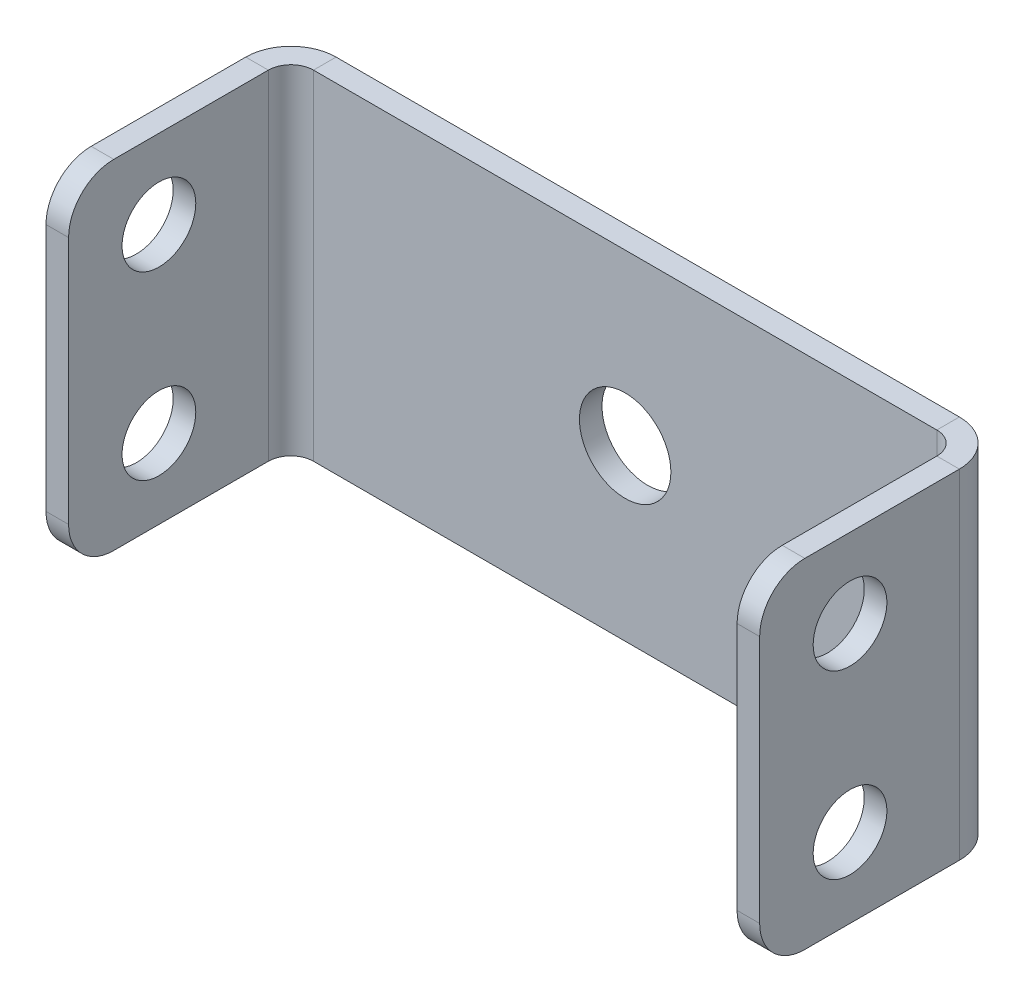
ISO-10303-21;
HEADER;
FILE_DESCRIPTION(('STEP AP214'),'2;1');
FILE_NAME('part.step','',(''),(''),'','','');
FILE_SCHEMA(('AUTOMOTIVE_DESIGN { 1 0 10303 214 1 1 1 1 }'));
ENDSEC;
DATA;
#1=APPLICATION_CONTEXT('core data for automotive mechanical design processes');
#2=APPLICATION_PROTOCOL_DEFINITION('international standard','automotive_design',2000,#1);
#3=PRODUCT_CONTEXT('',#1,'mechanical');
#4=PRODUCT('Part','Part','',(#3));
#5=PRODUCT_RELATED_PRODUCT_CATEGORY('part','',(#4));
#6=PRODUCT_DEFINITION_FORMATION('','',#4);
#7=PRODUCT_DEFINITION_CONTEXT('part definition',#1,'design');
#8=PRODUCT_DEFINITION('design','',#6,#7);
#9=PRODUCT_DEFINITION_SHAPE('','',#8);
#10=(LENGTH_UNIT() NAMED_UNIT(*) SI_UNIT(.MILLI.,.METRE.));
#11=(NAMED_UNIT(*) PLANE_ANGLE_UNIT() SI_UNIT($,.RADIAN.));
#12=(NAMED_UNIT(*) SI_UNIT($,.STERADIAN.) SOLID_ANGLE_UNIT());
#13=UNCERTAINTY_MEASURE_WITH_UNIT(LENGTH_MEASURE(1.E-05),#10,'distance_accuracy_value','');
#14=(GEOMETRIC_REPRESENTATION_CONTEXT(3) GLOBAL_UNCERTAINTY_ASSIGNED_CONTEXT((#13)) GLOBAL_UNIT_ASSIGNED_CONTEXT((#10,
#11,#12)) REPRESENTATION_CONTEXT('',''));
#15=CARTESIAN_POINT('',(0.,0.,0.));
#16=DIRECTION('',(0.,0.,1.));
#17=DIRECTION('',(1.,0.,0.));
#18=AXIS2_PLACEMENT_3D('',#15,#16,#17);
#19=CARTESIAN_POINT('',(0.,0.,-1.));
#20=DIRECTION('',(0.,0.,1.));
#21=DIRECTION('',(1.,0.,0.));
#22=AXIS2_PLACEMENT_3D('',#19,#20,#21);
#23=PLANE('',#22);
#24=CARTESIAN_POINT('',(0.,0.,-1.));
#25=DIRECTION('',(0.,0.,1.));
#26=DIRECTION('',(1.,0.,0.));
#27=AXIS2_PLACEMENT_3D('',#24,#25,#26);
#28=CIRCLE('',#27,2.025);
#29=CARTESIAN_POINT('',(2.025,0.,-1.));
#30=VERTEX_POINT('',#29);
#31=EDGE_CURVE('E257',#30,#30,#28,.T.);
#32=ORIENTED_EDGE('',*,*,#31,.T.);
#33=EDGE_LOOP('',(#32));
#34=FACE_BOUND('',#33,.T.);
#35=DIRECTION('',(-1.,0.,0.));
#36=VECTOR('',#35,1.);
#37=CARTESIAN_POINT('',(-25.,7.5,-1.));
#38=LINE('',#37,#36);
#39=CARTESIAN_POINT('',(13.8,7.5,-1.));
#40=VERTEX_POINT('',#39);
#41=CARTESIAN_POINT('',(-13.8,7.5,-1.));
#42=VERTEX_POINT('',#41);
#43=EDGE_CURVE('E286',#40,#42,#38,.T.);
#44=ORIENTED_EDGE('',*,*,#43,.F.);
#45=DIRECTION('',(0.,-1.,0.));
#46=VECTOR('',#45,1.);
#47=CARTESIAN_POINT('',(13.8,0.,-1.));
#48=LINE('',#47,#46);
#49=CARTESIAN_POINT('',(13.8,-7.5,-1.));
#50=VERTEX_POINT('',#49);
#51=EDGE_CURVE('E196',#40,#50,#48,.T.);
#52=ORIENTED_EDGE('',*,*,#51,.T.);
#53=DIRECTION('',(1.,0.,0.));
#54=VECTOR('',#53,1.);
#55=CARTESIAN_POINT('',(-25.,-7.5,-1.));
#56=LINE('',#55,#54);
#57=CARTESIAN_POINT('',(-13.8,-7.5,-1.));
#58=VERTEX_POINT('',#57);
#59=EDGE_CURVE('E266',#58,#50,#56,.T.);
#60=ORIENTED_EDGE('',*,*,#59,.F.);
#61=DIRECTION('',(0.,1.,0.));
#62=VECTOR('',#61,1.);
#63=CARTESIAN_POINT('',(-13.8,0.,-1.));
#64=LINE('',#63,#62);
#65=EDGE_CURVE('E263',#58,#42,#64,.T.);
#66=ORIENTED_EDGE('',*,*,#65,.T.);
#67=EDGE_LOOP('',(#44,#52,#60,#66));
#68=FACE_BOUND('',#67,.T.);
#69=ADVANCED_FACE('F43',(#34,#68),#23,.F.);
#70=CARTESIAN_POINT('',(-25.,-7.5,-1.));
#71=DIRECTION('',(0.,-1.,0.));
#72=DIRECTION('',(0.,0.,-1.));
#73=AXIS2_PLACEMENT_3D('',#70,#71,#72);
#74=PLANE('',#73);
#75=DIRECTION('',(0.,0.,-1.));
#76=VECTOR('',#75,1.);
#77=CARTESIAN_POINT('',(13.8,-7.5,-1.));
#78=LINE('',#77,#76);
#79=CARTESIAN_POINT('',(13.8,-7.5,0.));
#80=VERTEX_POINT('',#79);
#81=EDGE_CURVE('E281',#80,#50,#78,.T.);
#82=ORIENTED_EDGE('',*,*,#81,.F.);
#83=DIRECTION('',(1.,0.,0.));
#84=VECTOR('',#83,1.);
#85=CARTESIAN_POINT('',(-25.,-7.5,0.));
#86=LINE('',#85,#84);
#87=CARTESIAN_POINT('',(-13.8,-7.5,0.));
#88=VERTEX_POINT('',#87);
#89=EDGE_CURVE('E287',#88,#80,#86,.T.);
#90=ORIENTED_EDGE('',*,*,#89,.F.);
#91=DIRECTION('',(0.,0.,1.));
#92=VECTOR('',#91,1.);
#93=CARTESIAN_POINT('',(-13.8,-7.5,-1.));
#94=LINE('',#93,#92);
#95=EDGE_CURVE('E265',#58,#88,#94,.T.);
#96=ORIENTED_EDGE('',*,*,#95,.F.);
#97=ORIENTED_EDGE('',*,*,#59,.T.);
#98=EDGE_LOOP('',(#82,#90,#96,#97));
#99=FACE_BOUND('',#98,.T.);
#100=ADVANCED_FACE('F353',(#99),#74,.T.);
#101=CARTESIAN_POINT('',(-25.,7.5,-1.));
#102=DIRECTION('',(0.,1.,0.));
#103=DIRECTION('',(0.,0.,1.));
#104=AXIS2_PLACEMENT_3D('',#101,#102,#103);
#105=PLANE('',#104);
#106=DIRECTION('',(0.,0.,1.));
#107=VECTOR('',#106,1.);
#108=CARTESIAN_POINT('',(13.8,7.5,-1.));
#109=LINE('',#108,#107);
#110=CARTESIAN_POINT('',(13.8,7.5,0.));
#111=VERTEX_POINT('',#110);
#112=EDGE_CURVE('E276',#40,#111,#109,.T.);
#113=ORIENTED_EDGE('',*,*,#112,.F.);
#114=ORIENTED_EDGE('',*,*,#43,.T.);
#115=DIRECTION('',(0.,0.,-1.));
#116=VECTOR('',#115,1.);
#117=CARTESIAN_POINT('',(-13.8,7.5,-1.));
#118=LINE('',#117,#116);
#119=CARTESIAN_POINT('',(-13.8,7.5,0.));
#120=VERTEX_POINT('',#119);
#121=EDGE_CURVE('E272',#120,#42,#118,.T.);
#122=ORIENTED_EDGE('',*,*,#121,.F.);
#123=DIRECTION('',(-1.,0.,0.));
#124=VECTOR('',#123,1.);
#125=CARTESIAN_POINT('',(-25.,7.5,0.));
#126=LINE('',#125,#124);
#127=EDGE_CURVE('E260',#111,#120,#126,.T.);
#128=ORIENTED_EDGE('',*,*,#127,.F.);
#129=EDGE_LOOP('',(#113,#114,#122,#128));
#130=FACE_BOUND('',#129,.T.);
#131=ADVANCED_FACE('F362',(#130),#105,.T.);
#132=CARTESIAN_POINT('',(0.,0.,0.));
#133=DIRECTION('',(0.,0.,1.));
#134=DIRECTION('',(1.,0.,0.));
#135=AXIS2_PLACEMENT_3D('',#132,#133,#134);
#136=PLANE('',#135);
#137=DIRECTION('',(0.,-1.,0.));
#138=VECTOR('',#137,1.);
#139=CARTESIAN_POINT('',(13.8,0.,0.));
#140=LINE('',#139,#138);
#141=EDGE_CURVE('E278',#111,#80,#140,.T.);
#142=ORIENTED_EDGE('',*,*,#141,.F.);
#143=ORIENTED_EDGE('',*,*,#127,.T.);
#144=DIRECTION('',(0.,1.,0.));
#145=VECTOR('',#144,1.);
#146=CARTESIAN_POINT('',(-13.8,0.,0.));
#147=LINE('',#146,#145);
#148=EDGE_CURVE('E269',#88,#120,#147,.T.);
#149=ORIENTED_EDGE('',*,*,#148,.F.);
#150=ORIENTED_EDGE('',*,*,#89,.T.);
#151=EDGE_LOOP('',(#142,#143,#149,#150));
#152=FACE_BOUND('',#151,.T.);
#153=CARTESIAN_POINT('',(0.,0.,0.));
#154=DIRECTION('',(0.,0.,1.));
#155=DIRECTION('',(1.,0.,0.));
#156=AXIS2_PLACEMENT_3D('',#153,#154,#155);
#157=CIRCLE('',#156,2.025);
#158=CARTESIAN_POINT('',(2.025,0.,0.));
#159=VERTEX_POINT('',#158);
#160=EDGE_CURVE('E252',#159,#159,#157,.T.);
#161=ORIENTED_EDGE('',*,*,#160,.F.);
#162=EDGE_LOOP('',(#161));
#163=FACE_BOUND('',#162,.T.);
#164=ADVANCED_FACE('F357',(#152,#163),#136,.T.);
#165=CARTESIAN_POINT('',(0.,0.,-1.));
#166=DIRECTION('',(0.,0.,1.));
#167=DIRECTION('',(1.,0.,0.));
#168=AXIS2_PLACEMENT_3D('',#165,#166,#167);
#169=CYLINDRICAL_SURFACE('',#168,2.025);
#170=ORIENTED_EDGE('',*,*,#31,.F.);
#171=EDGE_LOOP('',(#170));
#172=FACE_BOUND('',#171,.T.);
#173=ORIENTED_EDGE('',*,*,#160,.T.);
#174=EDGE_LOOP('',(#173));
#175=FACE_BOUND('',#174,.T.);
#176=ADVANCED_FACE('F438',(#172,#175),#169,.F.);
#177=CARTESIAN_POINT('',(-13.8,-7.5,1.));
#178=DIRECTION('',(0.,-1.,0.));
#179=DIRECTION('',(1.,0.,0.));
#180=AXIS2_PLACEMENT_3D('',#177,#178,#179);
#181=PLANE('',#180);
#182=ORIENTED_EDGE('',*,*,#95,.T.);
#183=CARTESIAN_POINT('',(-13.8,-7.5,1.));
#184=DIRECTION('',(0.,1.,0.));
#185=DIRECTION('',(-1.,0.,0.));
#186=AXIS2_PLACEMENT_3D('',#183,#184,#185);
#187=CIRCLE('',#186,1.);
#188=CARTESIAN_POINT('',(-14.8,-7.5,1.));
#189=VERTEX_POINT('',#188);
#190=EDGE_CURVE('E210',#88,#189,#187,.T.);
#191=ORIENTED_EDGE('',*,*,#190,.T.);
#192=DIRECTION('',(1.,0.,0.));
#193=VECTOR('',#192,1.);
#194=CARTESIAN_POINT('',(-15.8,-7.5,1.));
#195=LINE('',#194,#193);
#196=CARTESIAN_POINT('',(-15.8,-7.5,1.00000000000001));
#197=VERTEX_POINT('',#196);
#198=EDGE_CURVE('E224',#197,#189,#195,.T.);
#199=ORIENTED_EDGE('',*,*,#198,.F.);
#200=CARTESIAN_POINT('',(-13.8,-7.5,1.));
#201=DIRECTION('',(0.,1.,0.));
#202=DIRECTION('',(1.,0.,0.));
#203=AXIS2_PLACEMENT_3D('',#200,#201,#202);
#204=CIRCLE('',#203,2.);
#205=EDGE_CURVE('E245',#58,#197,#204,.T.);
#206=ORIENTED_EDGE('',*,*,#205,.F.);
#207=EDGE_LOOP('',(#182,#191,#199,#206));
#208=FACE_BOUND('',#207,.T.);
#209=ADVANCED_FACE('F348',(#208),#181,.T.);
#210=CARTESIAN_POINT('',(-13.8,7.5,1.));
#211=DIRECTION('',(0.,1.,0.));
#212=DIRECTION('',(0.,0.,1.));
#213=AXIS2_PLACEMENT_3D('',#210,#211,#212);
#214=PLANE('',#213);
#215=DIRECTION('',(-1.,0.,0.));
#216=VECTOR('',#215,1.);
#217=CARTESIAN_POINT('',(-15.8,7.5,1.));
#218=LINE('',#217,#216);
#219=CARTESIAN_POINT('',(-14.8,7.5,1.));
#220=VERTEX_POINT('',#219);
#221=CARTESIAN_POINT('',(-15.8,7.5,1.00000000000002));
#222=VERTEX_POINT('',#221);
#223=EDGE_CURVE('E211',#220,#222,#218,.T.);
#224=ORIENTED_EDGE('',*,*,#223,.F.);
#225=CARTESIAN_POINT('',(-13.8,7.5,1.));
#226=DIRECTION('',(0.,1.,0.));
#227=DIRECTION('',(-1.,0.,0.));
#228=AXIS2_PLACEMENT_3D('',#225,#226,#227);
#229=CIRCLE('',#228,1.);
#230=EDGE_CURVE('E249',#220,#120,#229,.F.);
#231=ORIENTED_EDGE('',*,*,#230,.T.);
#232=ORIENTED_EDGE('',*,*,#121,.T.);
#233=CARTESIAN_POINT('',(-13.8,7.5,1.));
#234=DIRECTION('',(0.,-1.,0.));
#235=DIRECTION('',(0.,0.,1.));
#236=AXIS2_PLACEMENT_3D('',#233,#234,#235);
#237=CIRCLE('',#236,2.);
#238=EDGE_CURVE('E248',#222,#42,#237,.T.);
#239=ORIENTED_EDGE('',*,*,#238,.F.);
#240=EDGE_LOOP('',(#224,#231,#232,#239));
#241=FACE_BOUND('',#240,.T.);
#242=ADVANCED_FACE('F365',(#241),#214,.T.);
#243=CARTESIAN_POINT('',(-13.8,-15.2168213656996,1.));
#244=DIRECTION('',(0.,1.,0.));
#245=DIRECTION('',(-1.,0.,0.));
#246=AXIS2_PLACEMENT_3D('',#243,#244,#245);
#247=CYLINDRICAL_SURFACE('',#246,2.);
#248=ORIENTED_EDGE('',*,*,#238,.T.);
#249=ORIENTED_EDGE('',*,*,#65,.F.);
#250=ORIENTED_EDGE('',*,*,#205,.T.);
#251=DIRECTION('',(0.,1.,0.));
#252=VECTOR('',#251,1.);
#253=CARTESIAN_POINT('',(-15.8,0.,1.));
#254=LINE('',#253,#252);
#255=EDGE_CURVE('E200',#197,#222,#254,.T.);
#256=ORIENTED_EDGE('',*,*,#255,.T.);
#257=EDGE_LOOP('',(#248,#249,#250,#256));
#258=FACE_BOUND('',#257,.T.);
#259=ADVANCED_FACE('F367',(#258),#247,.T.);
#260=CARTESIAN_POINT('',(-13.8,-15.2168213656996,1.));
#261=DIRECTION('',(0.,1.,0.));
#262=DIRECTION('',(-1.,0.,0.));
#263=AXIS2_PLACEMENT_3D('',#260,#261,#262);
#264=CYLINDRICAL_SURFACE('',#263,1.);
#265=ORIENTED_EDGE('',*,*,#230,.F.);
#266=DIRECTION('',(0.,1.,0.));
#267=VECTOR('',#266,1.);
#268=CARTESIAN_POINT('',(-14.8,0.,1.));
#269=LINE('',#268,#267);
#270=EDGE_CURVE('E219',#189,#220,#269,.T.);
#271=ORIENTED_EDGE('',*,*,#270,.F.);
#272=ORIENTED_EDGE('',*,*,#190,.F.);
#273=ORIENTED_EDGE('',*,*,#148,.T.);
#274=EDGE_LOOP('',(#265,#271,#272,#273));
#275=FACE_BOUND('',#274,.T.);
#276=ADVANCED_FACE('F347',(#275),#264,.F.);
#277=CARTESIAN_POINT('',(-14.8,-4.,5.84380550980764));
#278=DIRECTION('',(1.,0.,0.));
#279=DIRECTION('',(0.,0.,-1.));
#280=AXIS2_PLACEMENT_3D('',#277,#278,#279);
#281=CYLINDRICAL_SURFACE('',#280,1.63195);
#282=CARTESIAN_POINT('',(-15.8,-4.,5.84380550980765));
#283=DIRECTION('',(1.,0.,0.));
#284=DIRECTION('',(0.,0.,-1.));
#285=AXIS2_PLACEMENT_3D('',#282,#283,#284);
#286=CIRCLE('',#285,1.63195);
#287=CARTESIAN_POINT('',(-15.8,-4.,4.21185550980765));
#288=VERTEX_POINT('',#287);
#289=EDGE_CURVE('E229',#288,#288,#286,.T.);
#290=ORIENTED_EDGE('',*,*,#289,.F.);
#291=EDGE_LOOP('',(#290));
#292=FACE_BOUND('',#291,.T.);
#293=CARTESIAN_POINT('',(-14.8,-4.,5.84380550980764));
#294=DIRECTION('',(1.,0.,0.));
#295=DIRECTION('',(0.,0.,-1.));
#296=AXIS2_PLACEMENT_3D('',#293,#294,#295);
#297=CIRCLE('',#296,1.63195);
#298=CARTESIAN_POINT('',(-14.8,-4.,4.21185550980764));
#299=VERTEX_POINT('',#298);
#300=EDGE_CURVE('E240',#299,#299,#297,.T.);
#301=ORIENTED_EDGE('',*,*,#300,.T.);
#302=EDGE_LOOP('',(#301));
#303=FACE_BOUND('',#302,.T.);
#304=ADVANCED_FACE('F460',(#292,#303),#281,.F.);
#305=CARTESIAN_POINT('',(-14.8,4.,5.84380550980764));
#306=DIRECTION('',(1.,0.,0.));
#307=DIRECTION('',(0.,0.,-1.));
#308=AXIS2_PLACEMENT_3D('',#305,#306,#307);
#309=CYLINDRICAL_SURFACE('',#308,1.63195);
#310=CARTESIAN_POINT('',(-15.8,4.,5.84380550980765));
#311=DIRECTION('',(1.,0.,0.));
#312=DIRECTION('',(0.,0.,-1.));
#313=AXIS2_PLACEMENT_3D('',#310,#311,#312);
#314=CIRCLE('',#313,1.63195);
#315=CARTESIAN_POINT('',(-15.8,4.,4.21185550980765));
#316=VERTEX_POINT('',#315);
#317=EDGE_CURVE('E232',#316,#316,#314,.T.);
#318=ORIENTED_EDGE('',*,*,#317,.F.);
#319=EDGE_LOOP('',(#318));
#320=FACE_BOUND('',#319,.T.);
#321=CARTESIAN_POINT('',(-14.8,4.,5.84380550980764));
#322=DIRECTION('',(1.,0.,0.));
#323=DIRECTION('',(0.,0.,-1.));
#324=AXIS2_PLACEMENT_3D('',#321,#322,#323);
#325=CIRCLE('',#324,1.63195);
#326=CARTESIAN_POINT('',(-14.8,4.,4.21185550980764));
#327=VERTEX_POINT('',#326);
#328=EDGE_CURVE('E237',#327,#327,#325,.T.);
#329=ORIENTED_EDGE('',*,*,#328,.T.);
#330=EDGE_LOOP('',(#329));
#331=FACE_BOUND('',#330,.T.);
#332=ADVANCED_FACE('F474',(#320,#331),#309,.F.);
#333=CARTESIAN_POINT('',(-15.8,7.5,9.84380550980765));
#334=DIRECTION('',(0.,0.,1.));
#335=DIRECTION('',(1.,0.,0.));
#336=AXIS2_PLACEMENT_3D('',#333,#334,#335);
#337=PLANE('',#336);
#338=DIRECTION('',(0.,-1.,0.));
#339=VECTOR('',#338,1.);
#340=CARTESIAN_POINT('',(-14.8,7.5,9.84380550980764));
#341=LINE('',#340,#339);
#342=CARTESIAN_POINT('',(-14.8,5.5,9.84380550980764));
#343=VERTEX_POINT('',#342);
#344=CARTESIAN_POINT('',(-14.8,-5.5,9.84380550980765));
#345=VERTEX_POINT('',#344);
#346=EDGE_CURVE('E213',#343,#345,#341,.T.);
#347=ORIENTED_EDGE('',*,*,#346,.F.);
#348=DIRECTION('',(1.,0.,0.));
#349=VECTOR('',#348,1.);
#350=CARTESIAN_POINT('',(-15.8,5.5,9.84380550980765));
#351=LINE('',#350,#349);
#352=CARTESIAN_POINT('',(-15.8,5.5,9.84380550980765));
#353=VERTEX_POINT('',#352);
#354=EDGE_CURVE('E318',#343,#353,#351,.F.);
#355=ORIENTED_EDGE('',*,*,#354,.T.);
#356=DIRECTION('',(0.,-1.,0.));
#357=VECTOR('',#356,1.);
#358=CARTESIAN_POINT('',(-15.8,7.5,9.84380550980765));
#359=LINE('',#358,#357);
#360=CARTESIAN_POINT('',(-15.8,-5.5,9.84380550980765));
#361=VERTEX_POINT('',#360);
#362=EDGE_CURVE('E235',#353,#361,#359,.T.);
#363=ORIENTED_EDGE('',*,*,#362,.T.);
#364=DIRECTION('',(1.,0.,0.));
#365=VECTOR('',#364,1.);
#366=CARTESIAN_POINT('',(-15.8,-5.5,9.84380550980765));
#367=LINE('',#366,#365);
#368=EDGE_CURVE('E315',#361,#345,#367,.T.);
#369=ORIENTED_EDGE('',*,*,#368,.T.);
#370=EDGE_LOOP('',(#347,#355,#363,#369));
#371=FACE_BOUND('',#370,.T.);
#372=ADVANCED_FACE('F336',(#371),#337,.T.);
#373=CARTESIAN_POINT('',(-15.8000000000001,0.,-15.1561944901924));
#374=DIRECTION('',(1.,0.,0.));
#375=DIRECTION('',(0.,0.,-1.));
#376=AXIS2_PLACEMENT_3D('',#373,#374,#375);
#377=PLANE('',#376);
#378=ORIENTED_EDGE('',*,*,#362,.F.);
#379=CARTESIAN_POINT('',(-15.8,5.5,7.84380550980765));
#380=DIRECTION('',(1.,0.,0.));
#381=DIRECTION('',(0.,0.,-1.));
#382=AXIS2_PLACEMENT_3D('',#379,#380,#381);
#383=CIRCLE('',#382,2.);
#384=CARTESIAN_POINT('',(-15.8,7.5,7.84380550980765));
#385=VERTEX_POINT('',#384);
#386=EDGE_CURVE('E51',#353,#385,#383,.F.);
#387=ORIENTED_EDGE('',*,*,#386,.T.);
#388=DIRECTION('',(0.,0.,1.));
#389=VECTOR('',#388,1.);
#390=CARTESIAN_POINT('',(-15.8,7.5,9.84380550980765));
#391=LINE('',#390,#389);
#392=EDGE_CURVE('E207',#222,#385,#391,.T.);
#393=ORIENTED_EDGE('',*,*,#392,.F.);
#394=ORIENTED_EDGE('',*,*,#255,.F.);
#395=DIRECTION('',(0.,0.,-1.));
#396=VECTOR('',#395,1.);
#397=CARTESIAN_POINT('',(-15.8,-7.5,9.84380550980765));
#398=LINE('',#397,#396);
#399=CARTESIAN_POINT('',(-15.8,-7.5,7.84380550980765));
#400=VERTEX_POINT('',#399);
#401=EDGE_CURVE('E227',#400,#197,#398,.T.);
#402=ORIENTED_EDGE('',*,*,#401,.F.);
#403=CARTESIAN_POINT('',(-15.8,-5.5,7.84380550980765));
#404=DIRECTION('',(1.,0.,0.));
#405=DIRECTION('',(0.,0.,-1.));
#406=AXIS2_PLACEMENT_3D('',#403,#404,#405);
#407=CIRCLE('',#406,2.);
#408=EDGE_CURVE('E63',#400,#361,#407,.F.);
#409=ORIENTED_EDGE('',*,*,#408,.T.);
#410=EDGE_LOOP('',(#378,#387,#393,#394,#402,#409));
#411=FACE_BOUND('',#410,.T.);
#412=ORIENTED_EDGE('',*,*,#317,.T.);
#413=EDGE_LOOP('',(#412));
#414=FACE_BOUND('',#413,.T.);
#415=ORIENTED_EDGE('',*,*,#289,.T.);
#416=EDGE_LOOP('',(#415));
#417=FACE_BOUND('',#416,.T.);
#418=ADVANCED_FACE('F322',(#411,#414,#417),#377,.F.);
#419=CARTESIAN_POINT('',(-15.8,-7.5,9.84380550980765));
#420=DIRECTION('',(0.,-1.,0.));
#421=DIRECTION('',(-1.,0.,0.));
#422=AXIS2_PLACEMENT_3D('',#419,#420,#421);
#423=PLANE('',#422);
#424=DIRECTION('',(0.,0.,-1.));
#425=VECTOR('',#424,1.);
#426=CARTESIAN_POINT('',(-14.8,-7.5,9.84380550980765));
#427=LINE('',#426,#425);
#428=CARTESIAN_POINT('',(-14.8,-7.5,7.84380550980765));
#429=VERTEX_POINT('',#428);
#430=EDGE_CURVE('E222',#429,#189,#427,.T.);
#431=ORIENTED_EDGE('',*,*,#430,.F.);
#432=DIRECTION('',(1.,0.,0.));
#433=VECTOR('',#432,1.);
#434=CARTESIAN_POINT('',(-15.8,-7.5,7.84380550980765));
#435=LINE('',#434,#433);
#436=EDGE_CURVE('E12',#429,#400,#435,.F.);
#437=ORIENTED_EDGE('',*,*,#436,.T.);
#438=ORIENTED_EDGE('',*,*,#401,.T.);
#439=ORIENTED_EDGE('',*,*,#198,.T.);
#440=EDGE_LOOP('',(#431,#437,#438,#439));
#441=FACE_BOUND('',#440,.T.);
#442=ADVANCED_FACE('F339',(#441),#423,.T.);
#443=CARTESIAN_POINT('',(-14.8000000000001,0.,-15.1561944901924));
#444=DIRECTION('',(1.,0.,0.));
#445=DIRECTION('',(0.,0.,-1.));
#446=AXIS2_PLACEMENT_3D('',#443,#444,#445);
#447=PLANE('',#446);
#448=ORIENTED_EDGE('',*,*,#300,.F.);
#449=EDGE_LOOP('',(#448));
#450=FACE_BOUND('',#449,.T.);
#451=ORIENTED_EDGE('',*,*,#328,.F.);
#452=EDGE_LOOP('',(#451));
#453=FACE_BOUND('',#452,.T.);
#454=DIRECTION('',(0.,0.,1.));
#455=VECTOR('',#454,1.);
#456=CARTESIAN_POINT('',(-14.8,7.5,9.84380550980764));
#457=LINE('',#456,#455);
#458=CARTESIAN_POINT('',(-14.8,7.5,7.84380550980764));
#459=VERTEX_POINT('',#458);
#460=EDGE_CURVE('E216',#220,#459,#457,.T.);
#461=ORIENTED_EDGE('',*,*,#460,.T.);
#462=CARTESIAN_POINT('',(-14.8,5.5,7.84380550980764));
#463=DIRECTION('',(1.,0.,0.));
#464=DIRECTION('',(0.,0.,-1.));
#465=AXIS2_PLACEMENT_3D('',#462,#463,#464);
#466=CIRCLE('',#465,2.);
#467=EDGE_CURVE('E313',#459,#343,#466,.T.);
#468=ORIENTED_EDGE('',*,*,#467,.T.);
#469=ORIENTED_EDGE('',*,*,#346,.T.);
#470=CARTESIAN_POINT('',(-14.8,-5.5,7.84380550980765));
#471=DIRECTION('',(1.,0.,0.));
#472=DIRECTION('',(0.,0.,-1.));
#473=AXIS2_PLACEMENT_3D('',#470,#471,#472);
#474=CIRCLE('',#473,2.);
#475=EDGE_CURVE('E311',#345,#429,#474,.T.);
#476=ORIENTED_EDGE('',*,*,#475,.T.);
#477=ORIENTED_EDGE('',*,*,#430,.T.);
#478=ORIENTED_EDGE('',*,*,#270,.T.);
#479=EDGE_LOOP('',(#461,#468,#469,#476,#477,#478));
#480=FACE_BOUND('',#479,.T.);
#481=ADVANCED_FACE('F334',(#450,#453,#480),#447,.T.);
#482=CARTESIAN_POINT('',(-15.8,7.5,9.84380550980765));
#483=DIRECTION('',(0.,1.,0.));
#484=DIRECTION('',(1.,0.,0.));
#485=AXIS2_PLACEMENT_3D('',#482,#483,#484);
#486=PLANE('',#485);
#487=ORIENTED_EDGE('',*,*,#392,.T.);
#488=DIRECTION('',(1.,0.,0.));
#489=VECTOR('',#488,1.);
#490=CARTESIAN_POINT('',(-15.8,7.5,7.84380550980765));
#491=LINE('',#490,#489);
#492=EDGE_CURVE('E308',#385,#459,#491,.T.);
#493=ORIENTED_EDGE('',*,*,#492,.T.);
#494=ORIENTED_EDGE('',*,*,#460,.F.);
#495=ORIENTED_EDGE('',*,*,#223,.T.);
#496=EDGE_LOOP('',(#487,#493,#494,#495));
#497=FACE_BOUND('',#496,.T.);
#498=ADVANCED_FACE('F329',(#497),#486,.T.);
#499=CARTESIAN_POINT('',(13.8,7.5,1.));
#500=DIRECTION('',(0.,1.,0.));
#501=DIRECTION('',(0.,0.,1.));
#502=AXIS2_PLACEMENT_3D('',#499,#500,#501);
#503=PLANE('',#502);
#504=ORIENTED_EDGE('',*,*,#112,.T.);
#505=CARTESIAN_POINT('',(13.8,7.5,1.));
#506=DIRECTION('',(0.,-1.,0.));
#507=DIRECTION('',(0.,0.,-1.));
#508=AXIS2_PLACEMENT_3D('',#505,#506,#507);
#509=CIRCLE('',#508,1.);
#510=CARTESIAN_POINT('',(14.8,7.5,1.));
#511=VERTEX_POINT('',#510);
#512=EDGE_CURVE('E191',#111,#511,#509,.T.);
#513=ORIENTED_EDGE('',*,*,#512,.T.);
#514=DIRECTION('',(-1.,0.,0.));
#515=VECTOR('',#514,1.);
#516=CARTESIAN_POINT('',(15.8,7.5,1.00000000000001));
#517=LINE('',#516,#515);
#518=CARTESIAN_POINT('',(15.8,7.5,1.00000000000001));
#519=VERTEX_POINT('',#518);
#520=EDGE_CURVE('E161',#519,#511,#517,.T.);
#521=ORIENTED_EDGE('',*,*,#520,.F.);
#522=CARTESIAN_POINT('',(13.8,7.5,1.));
#523=DIRECTION('',(0.,-1.,0.));
#524=DIRECTION('',(0.,0.,1.));
#525=AXIS2_PLACEMENT_3D('',#522,#523,#524);
#526=CIRCLE('',#525,2.);
#527=EDGE_CURVE('E188',#40,#519,#526,.T.);
#528=ORIENTED_EDGE('',*,*,#527,.F.);
#529=EDGE_LOOP('',(#504,#513,#521,#528));
#530=FACE_BOUND('',#529,.T.);
#531=ADVANCED_FACE('F187',(#530),#503,.T.);
#532=CARTESIAN_POINT('',(13.8,-7.5,1.));
#533=DIRECTION('',(0.,-1.,0.));
#534=DIRECTION('',(0.,0.,-1.));
#535=AXIS2_PLACEMENT_3D('',#532,#533,#534);
#536=PLANE('',#535);
#537=DIRECTION('',(1.,0.,0.));
#538=VECTOR('',#537,1.);
#539=CARTESIAN_POINT('',(15.8,-7.5,1.00000000000001));
#540=LINE('',#539,#538);
#541=CARTESIAN_POINT('',(14.8,-7.5,1.));
#542=VERTEX_POINT('',#541);
#543=CARTESIAN_POINT('',(15.8,-7.5,1.00000000000001));
#544=VERTEX_POINT('',#543);
#545=EDGE_CURVE('E373',#542,#544,#540,.T.);
#546=ORIENTED_EDGE('',*,*,#545,.F.);
#547=CARTESIAN_POINT('',(13.8,-7.5,1.));
#548=DIRECTION('',(0.,-1.,0.));
#549=DIRECTION('',(0.,0.,-1.));
#550=AXIS2_PLACEMENT_3D('',#547,#548,#549);
#551=CIRCLE('',#550,1.);
#552=EDGE_CURVE('E198',#542,#80,#551,.F.);
#553=ORIENTED_EDGE('',*,*,#552,.T.);
#554=ORIENTED_EDGE('',*,*,#81,.T.);
#555=CARTESIAN_POINT('',(13.8,-7.5,1.));
#556=DIRECTION('',(0.,1.,0.));
#557=DIRECTION('',(0.,0.,-1.));
#558=AXIS2_PLACEMENT_3D('',#555,#556,#557);
#559=CIRCLE('',#558,2.);
#560=EDGE_CURVE('E197',#544,#50,#559,.T.);
#561=ORIENTED_EDGE('',*,*,#560,.F.);
#562=EDGE_LOOP('',(#546,#553,#554,#561));
#563=FACE_BOUND('',#562,.T.);
#564=ADVANCED_FACE('F371',(#563),#536,.T.);
#565=CARTESIAN_POINT('',(13.8,15.2168213656996,1.));
#566=DIRECTION('',(0.,-1.,0.));
#567=DIRECTION('',(0.,0.,-1.));
#568=AXIS2_PLACEMENT_3D('',#565,#566,#567);
#569=CYLINDRICAL_SURFACE('',#568,2.);
#570=ORIENTED_EDGE('',*,*,#560,.T.);
#571=ORIENTED_EDGE('',*,*,#51,.F.);
#572=ORIENTED_EDGE('',*,*,#527,.T.);
#573=DIRECTION('',(0.,-1.,0.));
#574=VECTOR('',#573,1.);
#575=CARTESIAN_POINT('',(15.8,0.,1.00000000000001));
#576=LINE('',#575,#574);
#577=EDGE_CURVE('E171',#519,#544,#576,.T.);
#578=ORIENTED_EDGE('',*,*,#577,.T.);
#579=EDGE_LOOP('',(#570,#571,#572,#578));
#580=FACE_BOUND('',#579,.T.);
#581=ADVANCED_FACE('F194',(#580),#569,.T.);
#582=CARTESIAN_POINT('',(13.8,15.2168213656996,1.));
#583=DIRECTION('',(0.,-1.,0.));
#584=DIRECTION('',(0.,0.,-1.));
#585=AXIS2_PLACEMENT_3D('',#582,#583,#584);
#586=CYLINDRICAL_SURFACE('',#585,1.);
#587=ORIENTED_EDGE('',*,*,#552,.F.);
#588=DIRECTION('',(0.,-1.,0.));
#589=VECTOR('',#588,1.);
#590=CARTESIAN_POINT('',(14.8,0.,1.));
#591=LINE('',#590,#589);
#592=EDGE_CURVE('E377',#511,#542,#591,.T.);
#593=ORIENTED_EDGE('',*,*,#592,.F.);
#594=ORIENTED_EDGE('',*,*,#512,.F.);
#595=ORIENTED_EDGE('',*,*,#141,.T.);
#596=EDGE_LOOP('',(#587,#593,#594,#595));
#597=FACE_BOUND('',#596,.T.);
#598=ADVANCED_FACE('F375',(#597),#586,.F.);
#599=CARTESIAN_POINT('',(14.8,4.,5.84380550980765));
#600=DIRECTION('',(-1.,0.,0.));
#601=DIRECTION('',(0.,0.,1.));
#602=AXIS2_PLACEMENT_3D('',#599,#600,#601);
#603=CYLINDRICAL_SURFACE('',#602,1.63195);
#604=CARTESIAN_POINT('',(15.8,4.,5.84380550980765));
#605=DIRECTION('',(-1.,0.,0.));
#606=DIRECTION('',(0.,0.,1.));
#607=AXIS2_PLACEMENT_3D('',#604,#605,#606);
#608=CIRCLE('',#607,1.63195);
#609=CARTESIAN_POINT('',(15.8,4.,7.47575550980765));
#610=VERTEX_POINT('',#609);
#611=EDGE_CURVE('E167',#610,#610,#608,.T.);
#612=ORIENTED_EDGE('',*,*,#611,.F.);
#613=EDGE_LOOP('',(#612));
#614=FACE_BOUND('',#613,.T.);
#615=CARTESIAN_POINT('',(14.8,4.,5.84380550980765));
#616=DIRECTION('',(-1.,0.,0.));
#617=DIRECTION('',(0.,0.,1.));
#618=AXIS2_PLACEMENT_3D('',#615,#616,#617);
#619=CIRCLE('',#618,1.63195);
#620=CARTESIAN_POINT('',(14.8,4.,7.47575550980765));
#621=VERTEX_POINT('',#620);
#622=EDGE_CURVE('E181',#621,#621,#619,.T.);
#623=ORIENTED_EDGE('',*,*,#622,.T.);
#624=EDGE_LOOP('',(#623));
#625=FACE_BOUND('',#624,.T.);
#626=ADVANCED_FACE('F400',(#614,#625),#603,.F.);
#627=CARTESIAN_POINT('',(14.8,-4.,5.84380550980765));
#628=DIRECTION('',(-1.,0.,0.));
#629=DIRECTION('',(0.,0.,1.));
#630=AXIS2_PLACEMENT_3D('',#627,#628,#629);
#631=CYLINDRICAL_SURFACE('',#630,1.63195);
#632=CARTESIAN_POINT('',(15.8,-4.,5.84380550980765));
#633=DIRECTION('',(-1.,0.,0.));
#634=DIRECTION('',(0.,0.,1.));
#635=AXIS2_PLACEMENT_3D('',#632,#633,#634);
#636=CIRCLE('',#635,1.63195);
#637=CARTESIAN_POINT('',(15.8,-4.,7.47575550980765));
#638=VERTEX_POINT('',#637);
#639=EDGE_CURVE('E389',#638,#638,#636,.T.);
#640=ORIENTED_EDGE('',*,*,#639,.F.);
#641=EDGE_LOOP('',(#640));
#642=FACE_BOUND('',#641,.T.);
#643=CARTESIAN_POINT('',(14.8,-4.,5.84380550980765));
#644=DIRECTION('',(-1.,0.,0.));
#645=DIRECTION('',(0.,0.,1.));
#646=AXIS2_PLACEMENT_3D('',#643,#644,#645);
#647=CIRCLE('',#646,1.63195);
#648=CARTESIAN_POINT('',(14.8,-4.,7.47575550980765));
#649=VERTEX_POINT('',#648);
#650=EDGE_CURVE('E395',#649,#649,#647,.T.);
#651=ORIENTED_EDGE('',*,*,#650,.T.);
#652=EDGE_LOOP('',(#651));
#653=FACE_BOUND('',#652,.T.);
#654=ADVANCED_FACE('F497',(#642,#653),#631,.F.);
#655=CARTESIAN_POINT('',(15.8,7.5,9.84380550980765));
#656=DIRECTION('',(0.,0.,1.));
#657=DIRECTION('',(0.,1.,0.));
#658=AXIS2_PLACEMENT_3D('',#655,#656,#657);
#659=PLANE('',#658);
#660=DIRECTION('',(0.,1.,0.));
#661=VECTOR('',#660,1.);
#662=CARTESIAN_POINT('',(14.8,7.5,9.84380550980764));
#663=LINE('',#662,#661);
#664=CARTESIAN_POINT('',(14.8,-5.5,9.84380550980765));
#665=VERTEX_POINT('',#664);
#666=CARTESIAN_POINT('',(14.8,5.5,9.84380550980764));
#667=VERTEX_POINT('',#666);
#668=EDGE_CURVE('E382',#665,#667,#663,.T.);
#669=ORIENTED_EDGE('',*,*,#668,.F.);
#670=DIRECTION('',(-1.,0.,0.));
#671=VECTOR('',#670,1.);
#672=CARTESIAN_POINT('',(15.8,-5.5,9.84380550980765));
#673=LINE('',#672,#671);
#674=CARTESIAN_POINT('',(15.8,-5.5,9.84380550980765));
#675=VERTEX_POINT('',#674);
#676=EDGE_CURVE('E301',#665,#675,#673,.F.);
#677=ORIENTED_EDGE('',*,*,#676,.T.);
#678=DIRECTION('',(0.,1.,0.));
#679=VECTOR('',#678,1.);
#680=CARTESIAN_POINT('',(15.8,7.5,9.84380550980765));
#681=LINE('',#680,#679);
#682=CARTESIAN_POINT('',(15.8,5.5,9.84380550980765));
#683=VERTEX_POINT('',#682);
#684=EDGE_CURVE('E392',#675,#683,#681,.T.);
#685=ORIENTED_EDGE('',*,*,#684,.T.);
#686=DIRECTION('',(-1.,0.,0.));
#687=VECTOR('',#686,1.);
#688=CARTESIAN_POINT('',(15.8,5.5,9.84380550980765));
#689=LINE('',#688,#687);
#690=EDGE_CURVE('E298',#683,#667,#689,.T.);
#691=ORIENTED_EDGE('',*,*,#690,.T.);
#692=EDGE_LOOP('',(#669,#677,#685,#691));
#693=FACE_BOUND('',#692,.T.);
#694=ADVANCED_FACE('F416',(#693),#659,.T.);
#695=CARTESIAN_POINT('',(15.8000000000001,0.,-15.1561944901923));
#696=DIRECTION('',(-1.,0.,0.));
#697=DIRECTION('',(0.,0.,1.));
#698=AXIS2_PLACEMENT_3D('',#695,#696,#697);
#699=PLANE('',#698);
#700=ORIENTED_EDGE('',*,*,#684,.F.);
#701=CARTESIAN_POINT('',(15.8,-5.5,7.84380550980765));
#702=DIRECTION('',(-1.,0.,0.));
#703=DIRECTION('',(0.,0.,1.));
#704=AXIS2_PLACEMENT_3D('',#701,#702,#703);
#705=CIRCLE('',#704,2.);
#706=CARTESIAN_POINT('',(15.8,-7.5,7.84380550980765));
#707=VERTEX_POINT('',#706);
#708=EDGE_CURVE('E305',#675,#707,#705,.F.);
#709=ORIENTED_EDGE('',*,*,#708,.T.);
#710=DIRECTION('',(0.,0.,1.));
#711=VECTOR('',#710,1.);
#712=CARTESIAN_POINT('',(15.8000000000001,-7.5,-40.1561944901923));
#713=LINE('',#712,#711);
#714=EDGE_CURVE('E176',#544,#707,#713,.T.);
#715=ORIENTED_EDGE('',*,*,#714,.F.);
#716=ORIENTED_EDGE('',*,*,#577,.F.);
#717=DIRECTION('',(0.,0.,-1.));
#718=VECTOR('',#717,1.);
#719=CARTESIAN_POINT('',(15.8000000000001,7.5,-40.1561944901923));
#720=LINE('',#719,#718);
#721=CARTESIAN_POINT('',(15.8,7.5,7.84380550980765));
#722=VERTEX_POINT('',#721);
#723=EDGE_CURVE('E156',#722,#519,#720,.T.);
#724=ORIENTED_EDGE('',*,*,#723,.F.);
#725=CARTESIAN_POINT('',(15.8,5.5,7.84380550980765));
#726=DIRECTION('',(-1.,0.,0.));
#727=DIRECTION('',(0.,0.,1.));
#728=AXIS2_PLACEMENT_3D('',#725,#726,#727);
#729=CIRCLE('',#728,2.);
#730=EDGE_CURVE('E303',#722,#683,#729,.F.);
#731=ORIENTED_EDGE('',*,*,#730,.T.);
#732=EDGE_LOOP('',(#700,#709,#715,#716,#724,#731));
#733=FACE_BOUND('',#732,.T.);
#734=ORIENTED_EDGE('',*,*,#639,.T.);
#735=EDGE_LOOP('',(#734));
#736=FACE_BOUND('',#735,.T.);
#737=ORIENTED_EDGE('',*,*,#611,.T.);
#738=EDGE_LOOP('',(#737));
#739=FACE_BOUND('',#738,.T.);
#740=ADVANCED_FACE('F173',(#733,#736,#739),#699,.F.);
#741=CARTESIAN_POINT('',(15.8000000000001,7.5,-40.1561944901923));
#742=DIRECTION('',(0.,1.,0.));
#743=DIRECTION('',(-1.,0.,0.));
#744=AXIS2_PLACEMENT_3D('',#741,#742,#743);
#745=PLANE('',#744);
#746=DIRECTION('',(0.,0.,-1.));
#747=VECTOR('',#746,1.);
#748=CARTESIAN_POINT('',(14.8000000000001,7.5,-40.1561944901923));
#749=LINE('',#748,#747);
#750=CARTESIAN_POINT('',(14.8,7.5,7.84380550980764));
#751=VERTEX_POINT('',#750);
#752=EDGE_CURVE('E192',#751,#511,#749,.T.);
#753=ORIENTED_EDGE('',*,*,#752,.F.);
#754=DIRECTION('',(-1.,0.,0.));
#755=VECTOR('',#754,1.);
#756=CARTESIAN_POINT('',(15.8,7.5,7.84380550980765));
#757=LINE('',#756,#755);
#758=EDGE_CURVE('E164',#751,#722,#757,.F.);
#759=ORIENTED_EDGE('',*,*,#758,.T.);
#760=ORIENTED_EDGE('',*,*,#723,.T.);
#761=ORIENTED_EDGE('',*,*,#520,.T.);
#762=EDGE_LOOP('',(#753,#759,#760,#761));
#763=FACE_BOUND('',#762,.T.);
#764=ADVANCED_FACE('F159',(#763),#745,.T.);
#765=CARTESIAN_POINT('',(14.8000000000001,0.,-15.1561944901923));
#766=DIRECTION('',(-1.,0.,0.));
#767=DIRECTION('',(0.,0.,1.));
#768=AXIS2_PLACEMENT_3D('',#765,#766,#767);
#769=PLANE('',#768);
#770=ORIENTED_EDGE('',*,*,#650,.F.);
#771=EDGE_LOOP('',(#770));
#772=FACE_BOUND('',#771,.T.);
#773=ORIENTED_EDGE('',*,*,#622,.F.);
#774=EDGE_LOOP('',(#773));
#775=FACE_BOUND('',#774,.T.);
#776=DIRECTION('',(0.,0.,1.));
#777=VECTOR('',#776,1.);
#778=CARTESIAN_POINT('',(14.8000000000001,-7.5,-40.1561944901923));
#779=LINE('',#778,#777);
#780=CARTESIAN_POINT('',(14.8,-7.5,7.84380550980765));
#781=VERTEX_POINT('',#780);
#782=EDGE_CURVE('E380',#542,#781,#779,.T.);
#783=ORIENTED_EDGE('',*,*,#782,.T.);
#784=CARTESIAN_POINT('',(14.8,-5.5,7.84380550980765));
#785=DIRECTION('',(-1.,0.,0.));
#786=DIRECTION('',(0.,0.,1.));
#787=AXIS2_PLACEMENT_3D('',#784,#785,#786);
#788=CIRCLE('',#787,2.);
#789=EDGE_CURVE('E296',#781,#665,#788,.T.);
#790=ORIENTED_EDGE('',*,*,#789,.T.);
#791=ORIENTED_EDGE('',*,*,#668,.T.);
#792=CARTESIAN_POINT('',(14.8,5.5,7.84380550980764));
#793=DIRECTION('',(-1.,0.,0.));
#794=DIRECTION('',(0.,0.,1.));
#795=AXIS2_PLACEMENT_3D('',#792,#793,#794);
#796=CIRCLE('',#795,2.);
#797=EDGE_CURVE('E294',#667,#751,#796,.T.);
#798=ORIENTED_EDGE('',*,*,#797,.T.);
#799=ORIENTED_EDGE('',*,*,#752,.T.);
#800=ORIENTED_EDGE('',*,*,#592,.T.);
#801=EDGE_LOOP('',(#783,#790,#791,#798,#799,#800));
#802=FACE_BOUND('',#801,.T.);
#803=ADVANCED_FACE('F402',(#772,#775,#802),#769,.T.);
#804=CARTESIAN_POINT('',(15.8000000000001,-7.5,-40.1561944901923));
#805=DIRECTION('',(0.,-1.,0.));
#806=DIRECTION('',(1.,0.,0.));
#807=AXIS2_PLACEMENT_3D('',#804,#805,#806);
#808=PLANE('',#807);
#809=ORIENTED_EDGE('',*,*,#714,.T.);
#810=DIRECTION('',(-1.,0.,0.));
#811=VECTOR('',#810,1.);
#812=CARTESIAN_POINT('',(15.8,-7.5,7.84380550980766));
#813=LINE('',#812,#811);
#814=EDGE_CURVE('E284',#707,#781,#813,.T.);
#815=ORIENTED_EDGE('',*,*,#814,.T.);
#816=ORIENTED_EDGE('',*,*,#782,.F.);
#817=ORIENTED_EDGE('',*,*,#545,.T.);
#818=EDGE_LOOP('',(#809,#815,#816,#817));
#819=FACE_BOUND('',#818,.T.);
#820=ADVANCED_FACE('F404',(#819),#808,.T.);
#821=CARTESIAN_POINT('',(15.8,-5.5,7.84380550980765));
#822=DIRECTION('',(-1.,0.,0.));
#823=DIRECTION('',(0.,0.,1.));
#824=AXIS2_PLACEMENT_3D('',#821,#822,#823);
#825=CYLINDRICAL_SURFACE('',#824,2.);
#826=ORIENTED_EDGE('',*,*,#708,.F.);
#827=ORIENTED_EDGE('',*,*,#676,.F.);
#828=ORIENTED_EDGE('',*,*,#789,.F.);
#829=ORIENTED_EDGE('',*,*,#814,.F.);
#830=EDGE_LOOP('',(#826,#827,#828,#829));
#831=FACE_BOUND('',#830,.T.);
#832=ADVANCED_FACE('F413',(#831),#825,.T.);
#833=CARTESIAN_POINT('',(15.8,5.5,7.84380550980765));
#834=DIRECTION('',(-1.,0.,0.));
#835=DIRECTION('',(0.,0.,1.));
#836=AXIS2_PLACEMENT_3D('',#833,#834,#835);
#837=CYLINDRICAL_SURFACE('',#836,2.);
#838=ORIENTED_EDGE('',*,*,#730,.F.);
#839=ORIENTED_EDGE('',*,*,#758,.F.);
#840=ORIENTED_EDGE('',*,*,#797,.F.);
#841=ORIENTED_EDGE('',*,*,#690,.F.);
#842=EDGE_LOOP('',(#838,#839,#840,#841));
#843=FACE_BOUND('',#842,.T.);
#844=ADVANCED_FACE('F419',(#843),#837,.T.);
#845=CARTESIAN_POINT('',(-15.8,5.5,7.84380550980765));
#846=DIRECTION('',(1.,0.,0.));
#847=DIRECTION('',(0.,0.,-1.));
#848=AXIS2_PLACEMENT_3D('',#845,#846,#847);
#849=CYLINDRICAL_SURFACE('',#848,2.);
#850=ORIENTED_EDGE('',*,*,#386,.F.);
#851=ORIENTED_EDGE('',*,*,#354,.F.);
#852=ORIENTED_EDGE('',*,*,#467,.F.);
#853=ORIENTED_EDGE('',*,*,#492,.F.);
#854=EDGE_LOOP('',(#850,#851,#852,#853));
#855=FACE_BOUND('',#854,.T.);
#856=ADVANCED_FACE('F331',(#855),#849,.T.);
#857=CARTESIAN_POINT('',(-15.8,-5.5,7.84380550980765));
#858=DIRECTION('',(1.,0.,0.));
#859=DIRECTION('',(0.,0.,-1.));
#860=AXIS2_PLACEMENT_3D('',#857,#858,#859);
#861=CYLINDRICAL_SURFACE('',#860,2.);
#862=ORIENTED_EDGE('',*,*,#408,.F.);
#863=ORIENTED_EDGE('',*,*,#436,.F.);
#864=ORIENTED_EDGE('',*,*,#475,.F.);
#865=ORIENTED_EDGE('',*,*,#368,.F.);
#866=EDGE_LOOP('',(#862,#863,#864,#865));
#867=FACE_BOUND('',#866,.T.);
#868=ADVANCED_FACE('F45',(#867),#861,.T.);
#869=CLOSED_SHELL('',(#69,#100,#131,#164,#176,#209,#242,#259,#276,#304,#332,#372,#418,#442,#481,
#498,#531,#564,#581,#598,#626,#654,#694,#740,#764,#803,#820,#832,#844,#856,#868));
#870=MANIFOLD_SOLID_BREP('B2',#869);
#871=ADVANCED_BREP_SHAPE_REPRESENTATION('',(#18,#870),#14);
#872=SHAPE_DEFINITION_REPRESENTATION(#9,#871);
ENDSEC;
END-ISO-10303-21;
